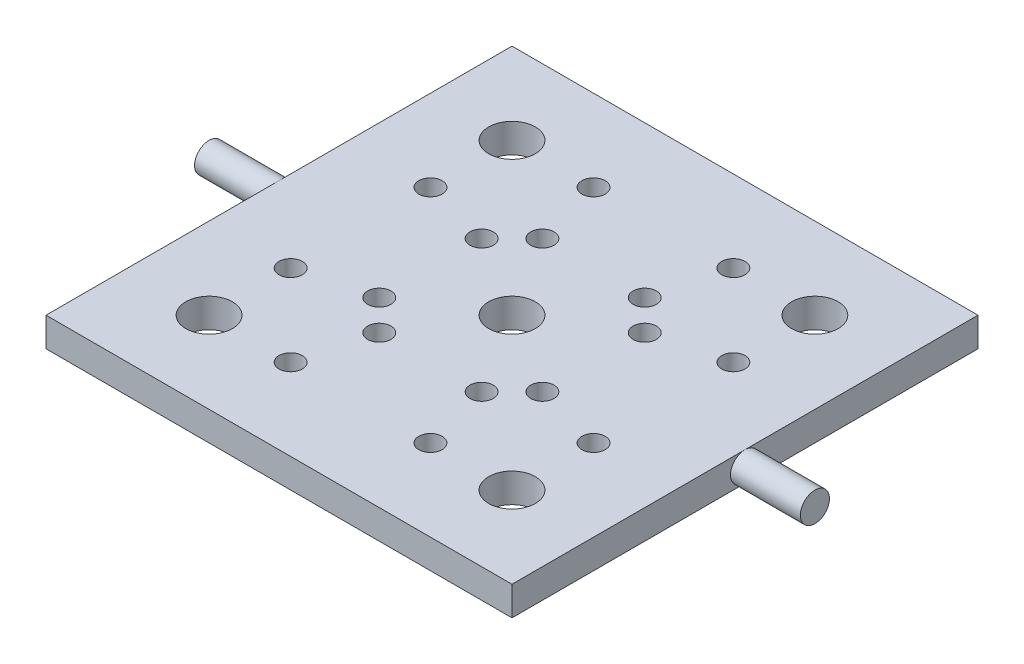
ISO-10303-21;
HEADER;
FILE_DESCRIPTION(('STEP AP214'),'2;1');
FILE_NAME('part.step','',(''),(''),'','','');
FILE_SCHEMA(('AUTOMOTIVE_DESIGN { 1 0 10303 214 1 1 1 1 }'));
ENDSEC;
DATA;
#1=APPLICATION_CONTEXT('core data for automotive mechanical design processes');
#2=APPLICATION_PROTOCOL_DEFINITION('international standard','automotive_design',2000,#1);
#3=PRODUCT_CONTEXT('',#1,'mechanical');
#4=PRODUCT('Part','Part','',(#3));
#5=PRODUCT_RELATED_PRODUCT_CATEGORY('part','',(#4));
#6=PRODUCT_DEFINITION_FORMATION('','',#4);
#7=PRODUCT_DEFINITION_CONTEXT('part definition',#1,'design');
#8=PRODUCT_DEFINITION('design','',#6,#7);
#9=PRODUCT_DEFINITION_SHAPE('','',#8);
#10=(LENGTH_UNIT() NAMED_UNIT(*) SI_UNIT(.MILLI.,.METRE.));
#11=(NAMED_UNIT(*) PLANE_ANGLE_UNIT() SI_UNIT($,.RADIAN.));
#12=(NAMED_UNIT(*) SI_UNIT($,.STERADIAN.) SOLID_ANGLE_UNIT());
#13=UNCERTAINTY_MEASURE_WITH_UNIT(LENGTH_MEASURE(1.E-05),#10,'distance_accuracy_value','');
#14=(GEOMETRIC_REPRESENTATION_CONTEXT(3) GLOBAL_UNCERTAINTY_ASSIGNED_CONTEXT((#13)) GLOBAL_UNIT_ASSIGNED_CONTEXT((#10,
#11,#12)) REPRESENTATION_CONTEXT('',''));
#15=CARTESIAN_POINT('',(0.,0.,0.));
#16=DIRECTION('',(0.,0.,1.));
#17=DIRECTION('',(1.,0.,0.));
#18=AXIS2_PLACEMENT_3D('',#15,#16,#17);
#19=CARTESIAN_POINT('',(-25.4,1.5875,25.4));
#20=DIRECTION('',(1.,0.,0.));
#21=DIRECTION('',(0.,0.,-1.));
#22=AXIS2_PLACEMENT_3D('',#19,#20,#21);
#23=PLANE('',#22);
#24=DIRECTION('',(0.,0.,1.));
#25=VECTOR('',#24,1.);
#26=CARTESIAN_POINT('',(-25.4,1.5875,25.4));
#27=LINE('',#26,#25);
#28=CARTESIAN_POINT('',(-25.4,1.5875,0.));
#29=VERTEX_POINT('',#28);
#30=CARTESIAN_POINT('',(-25.4,1.5875,25.4));
#31=VERTEX_POINT('',#30);
#32=EDGE_CURVE('E101',#29,#31,#27,.T.);
#33=ORIENTED_EDGE('',*,*,#32,.F.);
#34=CARTESIAN_POINT('',(-25.4,0.,0.));
#35=DIRECTION('',(1.,0.,0.));
#36=DIRECTION('',(0.,0.,-1.));
#37=AXIS2_PLACEMENT_3D('',#34,#35,#36);
#38=CIRCLE('',#37,1.5875);
#39=CARTESIAN_POINT('',(-25.4,-1.5875,0.));
#40=VERTEX_POINT('',#39);
#41=EDGE_CURVE('E51',#29,#40,#38,.T.);
#42=ORIENTED_EDGE('',*,*,#41,.T.);
#43=DIRECTION('',(0.,0.,1.));
#44=VECTOR('',#43,1.);
#45=CARTESIAN_POINT('',(-25.4,-1.5875,25.4));
#46=LINE('',#45,#44);
#47=CARTESIAN_POINT('',(-25.4,-1.5875,25.4));
#48=VERTEX_POINT('',#47);
#49=EDGE_CURVE('E99',#40,#48,#46,.T.);
#50=ORIENTED_EDGE('',*,*,#49,.T.);
#51=DIRECTION('',(0.,-1.,0.));
#52=VECTOR('',#51,1.);
#53=CARTESIAN_POINT('',(-25.4,1.5875,25.4));
#54=LINE('',#53,#52);
#55=EDGE_CURVE('E132',#31,#48,#54,.T.);
#56=ORIENTED_EDGE('',*,*,#55,.F.);
#57=EDGE_LOOP('',(#33,#42,#50,#56));
#58=FACE_BOUND('',#57,.T.);
#59=ADVANCED_FACE('F39',(#58),#23,.F.);
#60=CARTESIAN_POINT('',(25.4,1.5875,25.4));
#61=DIRECTION('',(-1.,0.,0.));
#62=DIRECTION('',(0.,0.,1.));
#63=AXIS2_PLACEMENT_3D('',#60,#61,#62);
#64=PLANE('',#63);
#65=CARTESIAN_POINT('',(25.4,0.,0.));
#66=DIRECTION('',(1.,0.,0.));
#67=DIRECTION('',(0.,0.,-1.));
#68=AXIS2_PLACEMENT_3D('',#65,#66,#67);
#69=CIRCLE('',#68,1.5875);
#70=CARTESIAN_POINT('',(25.4,1.5875,0.));
#71=VERTEX_POINT('',#70);
#72=CARTESIAN_POINT('',(25.4,-1.5875,0.));
#73=VERTEX_POINT('',#72);
#74=EDGE_CURVE('E143',#71,#73,#69,.T.);
#75=ORIENTED_EDGE('',*,*,#74,.F.);
#76=DIRECTION('',(0.,0.,-1.));
#77=VECTOR('',#76,1.);
#78=CARTESIAN_POINT('',(25.4,1.5875,25.4));
#79=LINE('',#78,#77);
#80=CARTESIAN_POINT('',(25.4,1.5875,25.4));
#81=VERTEX_POINT('',#80);
#82=EDGE_CURVE('E353',#81,#71,#79,.T.);
#83=ORIENTED_EDGE('',*,*,#82,.F.);
#84=DIRECTION('',(0.,-1.,0.));
#85=VECTOR('',#84,1.);
#86=CARTESIAN_POINT('',(25.4,1.5875,25.4));
#87=LINE('',#86,#85);
#88=CARTESIAN_POINT('',(25.4,-1.5875,25.4));
#89=VERTEX_POINT('',#88);
#90=EDGE_CURVE('E128',#81,#89,#87,.T.);
#91=ORIENTED_EDGE('',*,*,#90,.T.);
#92=DIRECTION('',(0.,0.,-1.));
#93=VECTOR('',#92,1.);
#94=CARTESIAN_POINT('',(25.4,-1.5875,25.4));
#95=LINE('',#94,#93);
#96=EDGE_CURVE('E362',#89,#73,#95,.T.);
#97=ORIENTED_EDGE('',*,*,#96,.T.);
#98=EDGE_LOOP('',(#75,#83,#91,#97));
#99=FACE_BOUND('',#98,.T.);
#100=ADVANCED_FACE('F361',(#99),#64,.F.);
#101=EDGE_CURVE('E49',#73,#71,#69,.T.);
#102=ORIENTED_EDGE('',*,*,#101,.F.);
#103=CARTESIAN_POINT('',(25.4,-1.5875,-25.4));
#104=VERTEX_POINT('',#103);
#105=EDGE_CURVE('E154',#73,#104,#95,.T.);
#106=ORIENTED_EDGE('',*,*,#105,.T.);
#107=DIRECTION('',(0.,-1.,0.));
#108=VECTOR('',#107,1.);
#109=CARTESIAN_POINT('',(25.4,1.5875,-25.4));
#110=LINE('',#109,#108);
#111=CARTESIAN_POINT('',(25.4,1.5875,-25.4));
#112=VERTEX_POINT('',#111);
#113=EDGE_CURVE('E43',#112,#104,#110,.T.);
#114=ORIENTED_EDGE('',*,*,#113,.F.);
#115=EDGE_CURVE('E123',#71,#112,#79,.T.);
#116=ORIENTED_EDGE('',*,*,#115,.F.);
#117=EDGE_LOOP('',(#102,#106,#114,#116));
#118=FACE_BOUND('',#117,.T.);
#119=ADVANCED_FACE('F41',(#118),#64,.F.);
#120=CARTESIAN_POINT('',(-25.4,1.5875,-25.4));
#121=DIRECTION('',(0.,0.,1.));
#122=DIRECTION('',(1.,0.,0.));
#123=AXIS2_PLACEMENT_3D('',#120,#121,#122);
#124=PLANE('',#123);
#125=DIRECTION('',(-1.,0.,0.));
#126=VECTOR('',#125,1.);
#127=CARTESIAN_POINT('',(-25.4,-1.5875,-25.4));
#128=LINE('',#127,#126);
#129=CARTESIAN_POINT('',(-25.4,-1.5875,-25.4));
#130=VERTEX_POINT('',#129);
#131=EDGE_CURVE('E115',#104,#130,#128,.T.);
#132=ORIENTED_EDGE('',*,*,#131,.T.);
#133=DIRECTION('',(0.,-1.,0.));
#134=VECTOR('',#133,1.);
#135=CARTESIAN_POINT('',(-25.4,1.5875,-25.4));
#136=LINE('',#135,#134);
#137=CARTESIAN_POINT('',(-25.4,1.5875,-25.4));
#138=VERTEX_POINT('',#137);
#139=EDGE_CURVE('E120',#138,#130,#136,.T.);
#140=ORIENTED_EDGE('',*,*,#139,.F.);
#141=DIRECTION('',(-1.,0.,0.));
#142=VECTOR('',#141,1.);
#143=CARTESIAN_POINT('',(-25.4,1.5875,-25.4));
#144=LINE('',#143,#142);
#145=EDGE_CURVE('E358',#112,#138,#144,.T.);
#146=ORIENTED_EDGE('',*,*,#145,.F.);
#147=ORIENTED_EDGE('',*,*,#113,.T.);
#148=EDGE_LOOP('',(#132,#140,#146,#147));
#149=FACE_BOUND('',#148,.T.);
#150=ADVANCED_FACE('F380',(#149),#124,.F.);
#151=EDGE_CURVE('E112',#130,#40,#46,.T.);
#152=ORIENTED_EDGE('',*,*,#151,.T.);
#153=EDGE_CURVE('E11',#40,#29,#38,.T.);
#154=ORIENTED_EDGE('',*,*,#153,.T.);
#155=EDGE_CURVE('E369',#138,#29,#27,.T.);
#156=ORIENTED_EDGE('',*,*,#155,.F.);
#157=ORIENTED_EDGE('',*,*,#139,.T.);
#158=EDGE_LOOP('',(#152,#154,#156,#157));
#159=FACE_BOUND('',#158,.T.);
#160=ADVANCED_FACE('F118',(#159),#23,.F.);
#161=CARTESIAN_POINT('',(-25.4,1.5875,25.4));
#162=DIRECTION('',(0.,0.,-1.));
#163=DIRECTION('',(-1.,0.,0.));
#164=AXIS2_PLACEMENT_3D('',#161,#162,#163);
#165=PLANE('',#164);
#166=DIRECTION('',(1.,0.,0.));
#167=VECTOR('',#166,1.);
#168=CARTESIAN_POINT('',(-25.4,-1.5875,25.4));
#169=LINE('',#168,#167);
#170=EDGE_CURVE('E113',#48,#89,#169,.T.);
#171=ORIENTED_EDGE('',*,*,#170,.T.);
#172=ORIENTED_EDGE('',*,*,#90,.F.);
#173=DIRECTION('',(1.,0.,0.));
#174=VECTOR('',#173,1.);
#175=CARTESIAN_POINT('',(-25.4,1.5875,25.4));
#176=LINE('',#175,#174);
#177=EDGE_CURVE('E133',#31,#81,#176,.T.);
#178=ORIENTED_EDGE('',*,*,#177,.F.);
#179=ORIENTED_EDGE('',*,*,#55,.T.);
#180=EDGE_LOOP('',(#171,#172,#178,#179));
#181=FACE_BOUND('',#180,.T.);
#182=ADVANCED_FACE('F341',(#181),#165,.F.);
#183=CARTESIAN_POINT('',(0.,1.5875,0.));
#184=DIRECTION('',(0.,-1.,0.));
#185=DIRECTION('',(0.,0.,-1.));
#186=AXIS2_PLACEMENT_3D('',#183,#184,#185);
#187=PLANE('',#186);
#188=CARTESIAN_POINT('',(-16.51,1.5875,7.62));
#189=DIRECTION('',(0.,1.,0.));
#190=DIRECTION('',(0.,0.,1.));
#191=AXIS2_PLACEMENT_3D('',#188,#189,#190);
#192=CIRCLE('',#191,1.27);
#193=CARTESIAN_POINT('',(-16.51,1.5875,8.89));
#194=VERTEX_POINT('',#193);
#195=EDGE_CURVE('E248',#194,#194,#192,.T.);
#196=ORIENTED_EDGE('',*,*,#195,.F.);
#197=EDGE_LOOP('',(#196));
#198=FACE_BOUND('',#197,.T.);
#199=CARTESIAN_POINT('',(16.51,1.5875,-7.62));
#200=DIRECTION('',(0.,1.,0.));
#201=DIRECTION('',(0.,0.,-1.));
#202=AXIS2_PLACEMENT_3D('',#199,#200,#201);
#203=CIRCLE('',#202,1.27);
#204=CARTESIAN_POINT('',(16.51,1.5875,-8.89));
#205=VERTEX_POINT('',#204);
#206=EDGE_CURVE('E257',#205,#205,#203,.T.);
#207=ORIENTED_EDGE('',*,*,#206,.F.);
#208=EDGE_LOOP('',(#207));
#209=FACE_BOUND('',#208,.T.);
#210=CARTESIAN_POINT('',(16.51,1.5875,7.62));
#211=DIRECTION('',(0.,1.,0.));
#212=DIRECTION('',(0.,0.,-1.));
#213=AXIS2_PLACEMENT_3D('',#210,#211,#212);
#214=CIRCLE('',#213,1.27);
#215=CARTESIAN_POINT('',(16.51,1.5875,6.35));
#216=VERTEX_POINT('',#215);
#217=EDGE_CURVE('E232',#216,#216,#214,.T.);
#218=ORIENTED_EDGE('',*,*,#217,.F.);
#219=EDGE_LOOP('',(#218));
#220=FACE_BOUND('',#219,.T.);
#221=CARTESIAN_POINT('',(-7.62000000000003,1.5875,16.51));
#222=DIRECTION('',(0.,1.,0.));
#223=DIRECTION('',(0.,0.,-1.));
#224=AXIS2_PLACEMENT_3D('',#221,#222,#223);
#225=CIRCLE('',#224,1.27);
#226=CARTESIAN_POINT('',(-7.62000000000003,1.5875,15.24));
#227=VERTEX_POINT('',#226);
#228=EDGE_CURVE('E241',#227,#227,#225,.T.);
#229=ORIENTED_EDGE('',*,*,#228,.F.);
#230=EDGE_LOOP('',(#229));
#231=FACE_BOUND('',#230,.T.);
#232=CARTESIAN_POINT('',(5.57822715367485,1.5875,-8.89000000000004));
#233=DIRECTION('',(0.,1.,0.));
#234=DIRECTION('',(0.,0.,1.));
#235=AXIS2_PLACEMENT_3D('',#232,#233,#234);
#236=CIRCLE('',#235,1.27000000000001);
#237=CARTESIAN_POINT('',(5.57822715367485,1.5875,-7.62000000000003));
#238=VERTEX_POINT('',#237);
#239=EDGE_CURVE('E289',#238,#238,#236,.T.);
#240=ORIENTED_EDGE('',*,*,#239,.F.);
#241=EDGE_LOOP('',(#240));
#242=FACE_BOUND('',#241,.T.);
#243=CARTESIAN_POINT('',(-5.57822715367482,1.5875,-8.88999999999993));
#244=DIRECTION('',(0.,1.,0.));
#245=DIRECTION('',(0.,0.,1.));
#246=AXIS2_PLACEMENT_3D('',#243,#244,#245);
#247=CIRCLE('',#246,1.27);
#248=CARTESIAN_POINT('',(-5.57822715367482,1.5875,-7.61999999999993));
#249=VERTEX_POINT('',#248);
#250=EDGE_CURVE('E281',#249,#249,#247,.T.);
#251=ORIENTED_EDGE('',*,*,#250,.F.);
#252=EDGE_LOOP('',(#251));
#253=FACE_BOUND('',#252,.T.);
#254=CARTESIAN_POINT('',(8.89000000000029,1.5875,5.57822715367478));
#255=DIRECTION('',(0.,1.,0.));
#256=DIRECTION('',(0.,0.,1.));
#257=AXIS2_PLACEMENT_3D('',#254,#255,#256);
#258=CIRCLE('',#257,1.27000000000001);
#259=CARTESIAN_POINT('',(8.89000000000029,1.5875,6.84822715367479));
#260=VERTEX_POINT('',#259);
#261=EDGE_CURVE('E273',#260,#260,#258,.T.);
#262=ORIENTED_EDGE('',*,*,#261,.F.);
#263=EDGE_LOOP('',(#262));
#264=FACE_BOUND('',#263,.T.);
#265=CARTESIAN_POINT('',(8.89000000000018,1.5875,-5.57822715367489));
#266=DIRECTION('',(0.,1.,0.));
#267=DIRECTION('',(0.,0.,1.));
#268=AXIS2_PLACEMENT_3D('',#265,#266,#267);
#269=CIRCLE('',#268,1.27);
#270=CARTESIAN_POINT('',(8.89000000000018,1.5875,-4.30822715367489));
#271=VERTEX_POINT('',#270);
#272=EDGE_CURVE('E264',#271,#271,#269,.T.);
#273=ORIENTED_EDGE('',*,*,#272,.F.);
#274=EDGE_LOOP('',(#273));
#275=FACE_BOUND('',#274,.T.);
#276=CARTESIAN_POINT('',(-16.51,1.5875,-16.51));
#277=DIRECTION('',(0.,1.,0.));
#278=DIRECTION('',(0.,0.,1.));
#279=AXIS2_PLACEMENT_3D('',#276,#277,#278);
#280=CIRCLE('',#279,2.54);
#281=CARTESIAN_POINT('',(-16.51,1.5875,-13.97));
#282=VERTEX_POINT('',#281);
#283=EDGE_CURVE('E193',#282,#282,#280,.T.);
#284=ORIENTED_EDGE('',*,*,#283,.F.);
#285=EDGE_LOOP('',(#284));
#286=FACE_BOUND('',#285,.T.);
#287=CARTESIAN_POINT('',(16.51,1.5875,-16.51));
#288=DIRECTION('',(0.,1.,0.));
#289=DIRECTION('',(0.,0.,1.));
#290=AXIS2_PLACEMENT_3D('',#287,#288,#289);
#291=CIRCLE('',#290,2.54);
#292=CARTESIAN_POINT('',(16.51,1.5875,-13.97));
#293=VERTEX_POINT('',#292);
#294=EDGE_CURVE('E185',#293,#293,#291,.T.);
#295=ORIENTED_EDGE('',*,*,#294,.F.);
#296=EDGE_LOOP('',(#295));
#297=FACE_BOUND('',#296,.T.);
#298=CARTESIAN_POINT('',(16.51,1.5875,16.51));
#299=DIRECTION('',(0.,1.,0.));
#300=DIRECTION('',(0.,0.,1.));
#301=AXIS2_PLACEMENT_3D('',#298,#299,#300);
#302=CIRCLE('',#301,2.54);
#303=CARTESIAN_POINT('',(16.51,1.5875,19.05));
#304=VERTEX_POINT('',#303);
#305=EDGE_CURVE('E177',#304,#304,#302,.T.);
#306=ORIENTED_EDGE('',*,*,#305,.F.);
#307=EDGE_LOOP('',(#306));
#308=FACE_BOUND('',#307,.T.);
#309=CARTESIAN_POINT('',(-16.51,1.5875,16.51));
#310=DIRECTION('',(0.,1.,0.));
#311=DIRECTION('',(0.,0.,1.));
#312=AXIS2_PLACEMENT_3D('',#309,#310,#311);
#313=CIRCLE('',#312,2.54);
#314=CARTESIAN_POINT('',(-16.51,1.5875,19.05));
#315=VERTEX_POINT('',#314);
#316=EDGE_CURVE('E168',#315,#315,#313,.T.);
#317=ORIENTED_EDGE('',*,*,#316,.F.);
#318=EDGE_LOOP('',(#317));
#319=FACE_BOUND('',#318,.T.);
#320=CARTESIAN_POINT('',(-16.51,1.5875,-7.62));
#321=DIRECTION('',(0.,1.,0.));
#322=DIRECTION('',(0.,0.,1.));
#323=AXIS2_PLACEMENT_3D('',#320,#321,#322);
#324=CIRCLE('',#323,1.27);
#325=CARTESIAN_POINT('',(-16.51,1.5875,-6.35));
#326=VERTEX_POINT('',#325);
#327=EDGE_CURVE('E225',#326,#326,#324,.T.);
#328=ORIENTED_EDGE('',*,*,#327,.F.);
#329=EDGE_LOOP('',(#328));
#330=FACE_BOUND('',#329,.T.);
#331=CARTESIAN_POINT('',(-7.62000000000001,1.5875,-16.51));
#332=DIRECTION('',(0.,1.,0.));
#333=DIRECTION('',(0.,0.,1.));
#334=AXIS2_PLACEMENT_3D('',#331,#332,#333);
#335=CIRCLE('',#334,1.27);
#336=CARTESIAN_POINT('',(-7.62000000000001,1.5875,-15.24));
#337=VERTEX_POINT('',#336);
#338=EDGE_CURVE('E217',#337,#337,#335,.T.);
#339=ORIENTED_EDGE('',*,*,#338,.F.);
#340=EDGE_LOOP('',(#339));
#341=FACE_BOUND('',#340,.T.);
#342=CARTESIAN_POINT('',(7.61999999999999,1.5875,-16.51));
#343=DIRECTION('',(0.,1.,0.));
#344=DIRECTION('',(0.,0.,1.));
#345=AXIS2_PLACEMENT_3D('',#342,#343,#344);
#346=CIRCLE('',#345,1.27);
#347=CARTESIAN_POINT('',(7.61999999999999,1.5875,-15.24));
#348=VERTEX_POINT('',#347);
#349=EDGE_CURVE('E209',#348,#348,#346,.T.);
#350=ORIENTED_EDGE('',*,*,#349,.F.);
#351=EDGE_LOOP('',(#350));
#352=FACE_BOUND('',#351,.T.);
#353=CARTESIAN_POINT('',(7.61999999999996,1.5875,16.51));
#354=DIRECTION('',(0.,1.,0.));
#355=DIRECTION('',(0.,0.,-1.));
#356=AXIS2_PLACEMENT_3D('',#353,#354,#355);
#357=CIRCLE('',#356,1.27);
#358=CARTESIAN_POINT('',(7.61999999999996,1.5875,15.24));
#359=VERTEX_POINT('',#358);
#360=EDGE_CURVE('E200',#359,#359,#357,.T.);
#361=ORIENTED_EDGE('',*,*,#360,.F.);
#362=EDGE_LOOP('',(#361));
#363=FACE_BOUND('',#362,.T.);
#364=CARTESIAN_POINT('',(-5.57822715367453,1.5875,8.89000000000022));
#365=DIRECTION('',(0.,1.,0.));
#366=DIRECTION('',(0.,0.,1.));
#367=AXIS2_PLACEMENT_3D('',#364,#365,#366);
#368=CIRCLE('',#367,1.27000000000001);
#369=CARTESIAN_POINT('',(-5.57822715367453,1.5875,10.1600000000002));
#370=VERTEX_POINT('',#369);
#371=EDGE_CURVE('E320',#370,#370,#368,.T.);
#372=ORIENTED_EDGE('',*,*,#371,.F.);
#373=EDGE_LOOP('',(#372));
#374=FACE_BOUND('',#373,.T.);
#375=CARTESIAN_POINT('',(5.57822715367514,1.5875,8.89000000000011));
#376=DIRECTION('',(0.,1.,0.));
#377=DIRECTION('',(0.,0.,1.));
#378=AXIS2_PLACEMENT_3D('',#375,#376,#377);
#379=CIRCLE('',#378,1.27);
#380=CARTESIAN_POINT('',(5.57822715367514,1.5875,10.1600000000001));
#381=VERTEX_POINT('',#380);
#382=EDGE_CURVE('E312',#381,#381,#379,.T.);
#383=ORIENTED_EDGE('',*,*,#382,.F.);
#384=EDGE_LOOP('',(#383));
#385=FACE_BOUND('',#384,.T.);
#386=CARTESIAN_POINT('',(-8.88999999999997,1.5875,-5.5782271536746));
#387=DIRECTION('',(0.,1.,0.));
#388=DIRECTION('',(0.,0.,1.));
#389=AXIS2_PLACEMENT_3D('',#386,#387,#388);
#390=CIRCLE('',#389,1.27000000000001);
#391=CARTESIAN_POINT('',(-8.88999999999997,1.5875,-4.30822715367459));
#392=VERTEX_POINT('',#391);
#393=EDGE_CURVE('E304',#392,#392,#390,.T.);
#394=ORIENTED_EDGE('',*,*,#393,.F.);
#395=EDGE_LOOP('',(#394));
#396=FACE_BOUND('',#395,.T.);
#397=CARTESIAN_POINT('',(-8.88999999999986,1.5875,5.57822715367507));
#398=DIRECTION('',(0.,1.,0.));
#399=DIRECTION('',(0.,0.,1.));
#400=AXIS2_PLACEMENT_3D('',#397,#398,#399);
#401=CIRCLE('',#400,1.27);
#402=CARTESIAN_POINT('',(-8.88999999999986,1.5875,6.84822715367507));
#403=VERTEX_POINT('',#402);
#404=EDGE_CURVE('E296',#403,#403,#401,.T.);
#405=ORIENTED_EDGE('',*,*,#404,.F.);
#406=EDGE_LOOP('',(#405));
#407=FACE_BOUND('',#406,.T.);
#408=CARTESIAN_POINT('',(0.,1.5875,0.));
#409=DIRECTION('',(0.,1.,0.));
#410=DIRECTION('',(0.,0.,1.));
#411=AXIS2_PLACEMENT_3D('',#408,#409,#410);
#412=CIRCLE('',#411,2.54);
#413=CARTESIAN_POINT('',(0.,1.5875,2.54));
#414=VERTEX_POINT('',#413);
#415=EDGE_CURVE('E160',#414,#414,#412,.T.);
#416=ORIENTED_EDGE('',*,*,#415,.F.);
#417=EDGE_LOOP('',(#416));
#418=FACE_BOUND('',#417,.T.);
#419=ORIENTED_EDGE('',*,*,#82,.T.);
#420=ORIENTED_EDGE('',*,*,#115,.T.);
#421=ORIENTED_EDGE('',*,*,#145,.T.);
#422=ORIENTED_EDGE('',*,*,#155,.T.);
#423=ORIENTED_EDGE('',*,*,#32,.T.);
#424=ORIENTED_EDGE('',*,*,#177,.T.);
#425=EDGE_LOOP('',(#419,#420,#421,#422,#423,#424));
#426=FACE_BOUND('',#425,.T.);
#427=ADVANCED_FACE('F338',(#198,#209,#220,#231,#242,#253,#264,#275,#286,#297,#308,#319,#330,
#341,#352,#363,#374,#385,#396,#407,#418,#426),#187,.F.);
#428=CARTESIAN_POINT('',(0.,-1.5875,0.));
#429=DIRECTION('',(0.,-1.,0.));
#430=DIRECTION('',(0.,0.,-1.));
#431=AXIS2_PLACEMENT_3D('',#428,#429,#430);
#432=PLANE('',#431);
#433=CARTESIAN_POINT('',(-16.51,-1.5875,7.62));
#434=DIRECTION('',(0.,1.,0.));
#435=DIRECTION('',(0.,0.,1.));
#436=AXIS2_PLACEMENT_3D('',#433,#434,#435);
#437=CIRCLE('',#436,1.27);
#438=CARTESIAN_POINT('',(-16.51,-1.5875,8.89));
#439=VERTEX_POINT('',#438);
#440=EDGE_CURVE('E252',#439,#439,#437,.T.);
#441=ORIENTED_EDGE('',*,*,#440,.T.);
#442=EDGE_LOOP('',(#441));
#443=FACE_BOUND('',#442,.T.);
#444=CARTESIAN_POINT('',(16.51,-1.5875,-7.62));
#445=DIRECTION('',(0.,1.,0.));
#446=DIRECTION('',(0.,0.,-1.));
#447=AXIS2_PLACEMENT_3D('',#444,#445,#446);
#448=CIRCLE('',#447,1.27);
#449=CARTESIAN_POINT('',(16.51,-1.5875,-8.89));
#450=VERTEX_POINT('',#449);
#451=EDGE_CURVE('E237',#450,#450,#448,.T.);
#452=ORIENTED_EDGE('',*,*,#451,.T.);
#453=EDGE_LOOP('',(#452));
#454=FACE_BOUND('',#453,.T.);
#455=CARTESIAN_POINT('',(16.51,-1.5875,7.62));
#456=DIRECTION('',(0.,1.,0.));
#457=DIRECTION('',(0.,0.,-1.));
#458=AXIS2_PLACEMENT_3D('',#455,#456,#457);
#459=CIRCLE('',#458,1.27);
#460=CARTESIAN_POINT('',(16.51,-1.5875,6.35));
#461=VERTEX_POINT('',#460);
#462=EDGE_CURVE('E236',#461,#461,#459,.T.);
#463=ORIENTED_EDGE('',*,*,#462,.T.);
#464=EDGE_LOOP('',(#463));
#465=FACE_BOUND('',#464,.T.);
#466=CARTESIAN_POINT('',(-7.62000000000003,-1.5875,16.51));
#467=DIRECTION('',(0.,1.,0.));
#468=DIRECTION('',(0.,0.,-1.));
#469=AXIS2_PLACEMENT_3D('',#466,#467,#468);
#470=CIRCLE('',#469,1.27);
#471=CARTESIAN_POINT('',(-7.62000000000003,-1.5875,15.24));
#472=VERTEX_POINT('',#471);
#473=EDGE_CURVE('E205',#472,#472,#470,.T.);
#474=ORIENTED_EDGE('',*,*,#473,.T.);
#475=EDGE_LOOP('',(#474));
#476=FACE_BOUND('',#475,.T.);
#477=CARTESIAN_POINT('',(5.57822715367485,-1.5875,-8.89000000000004));
#478=DIRECTION('',(0.,1.,0.));
#479=DIRECTION('',(0.,0.,1.));
#480=AXIS2_PLACEMENT_3D('',#477,#478,#479);
#481=CIRCLE('',#480,1.27000000000001);
#482=CARTESIAN_POINT('',(5.57822715367485,-1.5875,-7.62000000000003));
#483=VERTEX_POINT('',#482);
#484=EDGE_CURVE('E253',#483,#483,#481,.T.);
#485=ORIENTED_EDGE('',*,*,#484,.T.);
#486=EDGE_LOOP('',(#485));
#487=FACE_BOUND('',#486,.T.);
#488=CARTESIAN_POINT('',(-5.57822715367482,-1.5875,-8.88999999999993));
#489=DIRECTION('',(0.,1.,0.));
#490=DIRECTION('',(0.,0.,1.));
#491=AXIS2_PLACEMENT_3D('',#488,#489,#490);
#492=CIRCLE('',#491,1.27);
#493=CARTESIAN_POINT('',(-5.57822715367482,-1.5875,-7.61999999999993));
#494=VERTEX_POINT('',#493);
#495=EDGE_CURVE('E285',#494,#494,#492,.T.);
#496=ORIENTED_EDGE('',*,*,#495,.T.);
#497=EDGE_LOOP('',(#496));
#498=FACE_BOUND('',#497,.T.);
#499=CARTESIAN_POINT('',(8.89000000000029,-1.5875,5.57822715367478));
#500=DIRECTION('',(0.,1.,0.));
#501=DIRECTION('',(0.,0.,1.));
#502=AXIS2_PLACEMENT_3D('',#499,#500,#501);
#503=CIRCLE('',#502,1.27000000000001);
#504=CARTESIAN_POINT('',(8.89000000000029,-1.5875,6.84822715367479));
#505=VERTEX_POINT('',#504);
#506=EDGE_CURVE('E277',#505,#505,#503,.T.);
#507=ORIENTED_EDGE('',*,*,#506,.T.);
#508=EDGE_LOOP('',(#507));
#509=FACE_BOUND('',#508,.T.);
#510=CARTESIAN_POINT('',(8.89000000000018,-1.5875,-5.57822715367489));
#511=DIRECTION('',(0.,1.,0.));
#512=DIRECTION('',(0.,0.,1.));
#513=AXIS2_PLACEMENT_3D('',#510,#511,#512);
#514=CIRCLE('',#513,1.27);
#515=CARTESIAN_POINT('',(8.89000000000018,-1.5875,-4.30822715367489));
#516=VERTEX_POINT('',#515);
#517=EDGE_CURVE('E268',#516,#516,#514,.T.);
#518=ORIENTED_EDGE('',*,*,#517,.T.);
#519=EDGE_LOOP('',(#518));
#520=FACE_BOUND('',#519,.T.);
#521=CARTESIAN_POINT('',(-16.51,-1.5875,-16.51));
#522=DIRECTION('',(0.,1.,0.));
#523=DIRECTION('',(0.,0.,1.));
#524=AXIS2_PLACEMENT_3D('',#521,#522,#523);
#525=CIRCLE('',#524,2.54);
#526=CARTESIAN_POINT('',(-16.51,-1.5875,-13.97));
#527=VERTEX_POINT('',#526);
#528=EDGE_CURVE('E164',#527,#527,#525,.T.);
#529=ORIENTED_EDGE('',*,*,#528,.T.);
#530=EDGE_LOOP('',(#529));
#531=FACE_BOUND('',#530,.T.);
#532=CARTESIAN_POINT('',(16.51,-1.5875,-16.51));
#533=DIRECTION('',(0.,1.,0.));
#534=DIRECTION('',(0.,0.,1.));
#535=AXIS2_PLACEMENT_3D('',#532,#533,#534);
#536=CIRCLE('',#535,2.54);
#537=CARTESIAN_POINT('',(16.51,-1.5875,-13.97));
#538=VERTEX_POINT('',#537);
#539=EDGE_CURVE('E189',#538,#538,#536,.T.);
#540=ORIENTED_EDGE('',*,*,#539,.T.);
#541=EDGE_LOOP('',(#540));
#542=FACE_BOUND('',#541,.T.);
#543=CARTESIAN_POINT('',(16.51,-1.5875,16.51));
#544=DIRECTION('',(0.,1.,0.));
#545=DIRECTION('',(0.,0.,1.));
#546=AXIS2_PLACEMENT_3D('',#543,#544,#545);
#547=CIRCLE('',#546,2.54);
#548=CARTESIAN_POINT('',(16.51,-1.5875,19.05));
#549=VERTEX_POINT('',#548);
#550=EDGE_CURVE('E181',#549,#549,#547,.T.);
#551=ORIENTED_EDGE('',*,*,#550,.T.);
#552=EDGE_LOOP('',(#551));
#553=FACE_BOUND('',#552,.T.);
#554=CARTESIAN_POINT('',(-16.51,-1.5875,16.51));
#555=DIRECTION('',(0.,1.,0.));
#556=DIRECTION('',(0.,0.,1.));
#557=AXIS2_PLACEMENT_3D('',#554,#555,#556);
#558=CIRCLE('',#557,2.54);
#559=CARTESIAN_POINT('',(-16.51,-1.5875,19.05));
#560=VERTEX_POINT('',#559);
#561=EDGE_CURVE('E172',#560,#560,#558,.T.);
#562=ORIENTED_EDGE('',*,*,#561,.T.);
#563=EDGE_LOOP('',(#562));
#564=FACE_BOUND('',#563,.T.);
#565=CARTESIAN_POINT('',(-16.51,-1.5875,-7.62));
#566=DIRECTION('',(0.,1.,0.));
#567=DIRECTION('',(0.,0.,1.));
#568=AXIS2_PLACEMENT_3D('',#565,#566,#567);
#569=CIRCLE('',#568,1.27);
#570=CARTESIAN_POINT('',(-16.51,-1.5875,-6.35));
#571=VERTEX_POINT('',#570);
#572=EDGE_CURVE('E173',#571,#571,#569,.T.);
#573=ORIENTED_EDGE('',*,*,#572,.T.);
#574=EDGE_LOOP('',(#573));
#575=FACE_BOUND('',#574,.T.);
#576=CARTESIAN_POINT('',(-7.62000000000001,-1.5875,-16.51));
#577=DIRECTION('',(0.,1.,0.));
#578=DIRECTION('',(0.,0.,1.));
#579=AXIS2_PLACEMENT_3D('',#576,#577,#578);
#580=CIRCLE('',#579,1.27);
#581=CARTESIAN_POINT('',(-7.62000000000001,-1.5875,-15.24));
#582=VERTEX_POINT('',#581);
#583=EDGE_CURVE('E221',#582,#582,#580,.T.);
#584=ORIENTED_EDGE('',*,*,#583,.T.);
#585=EDGE_LOOP('',(#584));
#586=FACE_BOUND('',#585,.T.);
#587=CARTESIAN_POINT('',(7.61999999999999,-1.5875,-16.51));
#588=DIRECTION('',(0.,1.,0.));
#589=DIRECTION('',(0.,0.,1.));
#590=AXIS2_PLACEMENT_3D('',#587,#588,#589);
#591=CIRCLE('',#590,1.27);
#592=CARTESIAN_POINT('',(7.61999999999999,-1.5875,-15.24));
#593=VERTEX_POINT('',#592);
#594=EDGE_CURVE('E213',#593,#593,#591,.T.);
#595=ORIENTED_EDGE('',*,*,#594,.T.);
#596=EDGE_LOOP('',(#595));
#597=FACE_BOUND('',#596,.T.);
#598=CARTESIAN_POINT('',(7.61999999999996,-1.5875,16.51));
#599=DIRECTION('',(0.,1.,0.));
#600=DIRECTION('',(0.,0.,-1.));
#601=AXIS2_PLACEMENT_3D('',#598,#599,#600);
#602=CIRCLE('',#601,1.27);
#603=CARTESIAN_POINT('',(7.61999999999996,-1.5875,15.24));
#604=VERTEX_POINT('',#603);
#605=EDGE_CURVE('E204',#604,#604,#602,.T.);
#606=ORIENTED_EDGE('',*,*,#605,.T.);
#607=EDGE_LOOP('',(#606));
#608=FACE_BOUND('',#607,.T.);
#609=CARTESIAN_POINT('',(-5.57822715367453,-1.5875,8.89000000000022));
#610=DIRECTION('',(0.,1.,0.));
#611=DIRECTION('',(0.,0.,1.));
#612=AXIS2_PLACEMENT_3D('',#609,#610,#611);
#613=CIRCLE('',#612,1.27000000000001);
#614=CARTESIAN_POINT('',(-5.57822715367453,-1.5875,10.1600000000002));
#615=VERTEX_POINT('',#614);
#616=EDGE_CURVE('E269',#615,#615,#613,.T.);
#617=ORIENTED_EDGE('',*,*,#616,.T.);
#618=EDGE_LOOP('',(#617));
#619=FACE_BOUND('',#618,.T.);
#620=CARTESIAN_POINT('',(5.57822715367514,-1.5875,8.89000000000011));
#621=DIRECTION('',(0.,1.,0.));
#622=DIRECTION('',(0.,0.,1.));
#623=AXIS2_PLACEMENT_3D('',#620,#621,#622);
#624=CIRCLE('',#623,1.27);
#625=CARTESIAN_POINT('',(5.57822715367514,-1.5875,10.1600000000001));
#626=VERTEX_POINT('',#625);
#627=EDGE_CURVE('E316',#626,#626,#624,.T.);
#628=ORIENTED_EDGE('',*,*,#627,.T.);
#629=EDGE_LOOP('',(#628));
#630=FACE_BOUND('',#629,.T.);
#631=CARTESIAN_POINT('',(-8.88999999999997,-1.5875,-5.5782271536746));
#632=DIRECTION('',(0.,1.,0.));
#633=DIRECTION('',(0.,0.,1.));
#634=AXIS2_PLACEMENT_3D('',#631,#632,#633);
#635=CIRCLE('',#634,1.27000000000001);
#636=CARTESIAN_POINT('',(-8.88999999999997,-1.5875,-4.30822715367459));
#637=VERTEX_POINT('',#636);
#638=EDGE_CURVE('E308',#637,#637,#635,.T.);
#639=ORIENTED_EDGE('',*,*,#638,.T.);
#640=EDGE_LOOP('',(#639));
#641=FACE_BOUND('',#640,.T.);
#642=CARTESIAN_POINT('',(-8.88999999999986,-1.5875,5.57822715367507));
#643=DIRECTION('',(0.,1.,0.));
#644=DIRECTION('',(0.,0.,1.));
#645=AXIS2_PLACEMENT_3D('',#642,#643,#644);
#646=CIRCLE('',#645,1.27);
#647=CARTESIAN_POINT('',(-8.88999999999986,-1.5875,6.84822715367507));
#648=VERTEX_POINT('',#647);
#649=EDGE_CURVE('E300',#648,#648,#646,.T.);
#650=ORIENTED_EDGE('',*,*,#649,.T.);
#651=EDGE_LOOP('',(#650));
#652=FACE_BOUND('',#651,.T.);
#653=CARTESIAN_POINT('',(0.,-1.5875,0.));
#654=DIRECTION('',(0.,1.,0.));
#655=DIRECTION('',(0.,0.,1.));
#656=AXIS2_PLACEMENT_3D('',#653,#654,#655);
#657=CIRCLE('',#656,2.54);
#658=CARTESIAN_POINT('',(0.,-1.5875,2.54));
#659=VERTEX_POINT('',#658);
#660=EDGE_CURVE('E105',#659,#659,#657,.T.);
#661=ORIENTED_EDGE('',*,*,#660,.T.);
#662=EDGE_LOOP('',(#661));
#663=FACE_BOUND('',#662,.T.);
#664=ORIENTED_EDGE('',*,*,#96,.F.);
#665=ORIENTED_EDGE('',*,*,#170,.F.);
#666=ORIENTED_EDGE('',*,*,#49,.F.);
#667=ORIENTED_EDGE('',*,*,#151,.F.);
#668=ORIENTED_EDGE('',*,*,#131,.F.);
#669=ORIENTED_EDGE('',*,*,#105,.F.);
#670=EDGE_LOOP('',(#664,#665,#666,#667,#668,#669));
#671=FACE_BOUND('',#670,.T.);
#672=ADVANCED_FACE('F110',(#443,#454,#465,#476,#487,#498,#509,#520,#531,#542,#553,#564,#575,
#586,#597,#608,#619,#630,#641,#652,#663,#671),#432,.T.);
#673=CARTESIAN_POINT('',(33.02,0.,0.));
#674=DIRECTION('',(-1.,0.,0.));
#675=DIRECTION('',(0.,0.,1.));
#676=AXIS2_PLACEMENT_3D('',#673,#674,#675);
#677=CYLINDRICAL_SURFACE('',#676,1.5875);
#678=CARTESIAN_POINT('',(33.02,0.,0.));
#679=DIRECTION('',(1.,0.,0.));
#680=DIRECTION('',(0.,0.,-1.));
#681=AXIS2_PLACEMENT_3D('',#678,#679,#680);
#682=CIRCLE('',#681,1.5875);
#683=CARTESIAN_POINT('',(33.02,0.,-1.5875));
#684=VERTEX_POINT('',#683);
#685=EDGE_CURVE('E149',#684,#684,#682,.T.);
#686=ORIENTED_EDGE('',*,*,#685,.F.);
#687=EDGE_LOOP('',(#686));
#688=FACE_BOUND('',#687,.T.);
#689=ORIENTED_EDGE('',*,*,#74,.T.);
#690=ORIENTED_EDGE('',*,*,#101,.T.);
#691=EDGE_LOOP('',(#689,#690));
#692=FACE_BOUND('',#691,.T.);
#693=ADVANCED_FACE('F456',(#688,#692),#677,.T.);
#694=CARTESIAN_POINT('',(33.02,0.,0.));
#695=DIRECTION('',(1.,0.,0.));
#696=DIRECTION('',(0.,0.,-1.));
#697=AXIS2_PLACEMENT_3D('',#694,#695,#696);
#698=PLANE('',#697);
#699=ORIENTED_EDGE('',*,*,#685,.T.);
#700=EDGE_LOOP('',(#699));
#701=FACE_BOUND('',#700,.T.);
#702=ADVANCED_FACE('F430',(#701),#698,.T.);
#703=CARTESIAN_POINT('',(-33.02,0.,0.));
#704=DIRECTION('',(1.,0.,0.));
#705=DIRECTION('',(0.,0.,-1.));
#706=AXIS2_PLACEMENT_3D('',#703,#704,#705);
#707=CYLINDRICAL_SURFACE('',#706,1.5875);
#708=CARTESIAN_POINT('',(-33.02,0.,0.));
#709=DIRECTION('',(1.,0.,0.));
#710=DIRECTION('',(0.,0.,-1.));
#711=AXIS2_PLACEMENT_3D('',#708,#709,#710);
#712=CIRCLE('',#711,1.5875);
#713=CARTESIAN_POINT('',(-33.02,0.,-1.5875));
#714=VERTEX_POINT('',#713);
#715=EDGE_CURVE('E104',#714,#714,#712,.T.);
#716=ORIENTED_EDGE('',*,*,#715,.T.);
#717=EDGE_LOOP('',(#716));
#718=FACE_BOUND('',#717,.T.);
#719=ORIENTED_EDGE('',*,*,#41,.F.);
#720=ORIENTED_EDGE('',*,*,#153,.F.);
#721=EDGE_LOOP('',(#719,#720));
#722=FACE_BOUND('',#721,.T.);
#723=ADVANCED_FACE('F91',(#718,#722),#707,.T.);
#724=CARTESIAN_POINT('',(-33.02,0.,0.));
#725=DIRECTION('',(-1.,0.,0.));
#726=DIRECTION('',(0.,0.,-1.));
#727=AXIS2_PLACEMENT_3D('',#724,#725,#726);
#728=PLANE('',#727);
#729=ORIENTED_EDGE('',*,*,#715,.F.);
#730=EDGE_LOOP('',(#729));
#731=FACE_BOUND('',#730,.T.);
#732=ADVANCED_FACE('F429',(#731),#728,.T.);
#733=CARTESIAN_POINT('',(0.,-1.5875,0.));
#734=DIRECTION('',(0.,1.,0.));
#735=DIRECTION('',(0.,0.,1.));
#736=AXIS2_PLACEMENT_3D('',#733,#734,#735);
#737=CYLINDRICAL_SURFACE('',#736,2.54);
#738=ORIENTED_EDGE('',*,*,#660,.F.);
#739=EDGE_LOOP('',(#738));
#740=FACE_BOUND('',#739,.T.);
#741=ORIENTED_EDGE('',*,*,#415,.T.);
#742=EDGE_LOOP('',(#741));
#743=FACE_BOUND('',#742,.T.);
#744=ADVANCED_FACE('F440',(#740,#743),#737,.F.);
#745=CARTESIAN_POINT('',(-8.88999999999986,-1.5875,5.57822715367507));
#746=DIRECTION('',(0.,1.,0.));
#747=DIRECTION('',(0.,0.,1.));
#748=AXIS2_PLACEMENT_3D('',#745,#746,#747);
#749=CYLINDRICAL_SURFACE('',#748,1.27);
#750=ORIENTED_EDGE('',*,*,#649,.F.);
#751=EDGE_LOOP('',(#750));
#752=FACE_BOUND('',#751,.T.);
#753=ORIENTED_EDGE('',*,*,#404,.T.);
#754=EDGE_LOOP('',(#753));
#755=FACE_BOUND('',#754,.T.);
#756=ADVANCED_FACE('F464',(#752,#755),#749,.F.);
#757=CARTESIAN_POINT('',(-8.88999999999997,-1.5875,-5.5782271536746));
#758=DIRECTION('',(0.,1.,0.));
#759=DIRECTION('',(0.,0.,1.));
#760=AXIS2_PLACEMENT_3D('',#757,#758,#759);
#761=CYLINDRICAL_SURFACE('',#760,1.27000000000001);
#762=ORIENTED_EDGE('',*,*,#638,.F.);
#763=EDGE_LOOP('',(#762));
#764=FACE_BOUND('',#763,.T.);
#765=ORIENTED_EDGE('',*,*,#393,.T.);
#766=EDGE_LOOP('',(#765));
#767=FACE_BOUND('',#766,.T.);
#768=ADVANCED_FACE('F474',(#764,#767),#761,.F.);
#769=CARTESIAN_POINT('',(5.57822715367514,-1.5875,8.89000000000011));
#770=DIRECTION('',(0.,1.,0.));
#771=DIRECTION('',(0.,0.,1.));
#772=AXIS2_PLACEMENT_3D('',#769,#770,#771);
#773=CYLINDRICAL_SURFACE('',#772,1.27);
#774=ORIENTED_EDGE('',*,*,#627,.F.);
#775=EDGE_LOOP('',(#774));
#776=FACE_BOUND('',#775,.T.);
#777=ORIENTED_EDGE('',*,*,#382,.T.);
#778=EDGE_LOOP('',(#777));
#779=FACE_BOUND('',#778,.T.);
#780=ADVANCED_FACE('F334',(#776,#779),#773,.F.);
#781=CARTESIAN_POINT('',(-5.57822715367453,-1.5875,8.89000000000022));
#782=DIRECTION('',(0.,1.,0.));
#783=DIRECTION('',(0.,0.,1.));
#784=AXIS2_PLACEMENT_3D('',#781,#782,#783);
#785=CYLINDRICAL_SURFACE('',#784,1.27000000000001);
#786=ORIENTED_EDGE('',*,*,#616,.F.);
#787=EDGE_LOOP('',(#786));
#788=FACE_BOUND('',#787,.T.);
#789=ORIENTED_EDGE('',*,*,#371,.T.);
#790=EDGE_LOOP('',(#789));
#791=FACE_BOUND('',#790,.T.);
#792=ADVANCED_FACE('F330',(#788,#791),#785,.F.);
#793=CARTESIAN_POINT('',(7.61999999999996,-1.5875,16.51));
#794=DIRECTION('',(0.,1.,0.));
#795=DIRECTION('',(0.,0.,1.));
#796=AXIS2_PLACEMENT_3D('',#793,#794,#795);
#797=CYLINDRICAL_SURFACE('',#796,1.27);
#798=ORIENTED_EDGE('',*,*,#605,.F.);
#799=EDGE_LOOP('',(#798));
#800=FACE_BOUND('',#799,.T.);
#801=ORIENTED_EDGE('',*,*,#360,.T.);
#802=EDGE_LOOP('',(#801));
#803=FACE_BOUND('',#802,.T.);
#804=ADVANCED_FACE('F333',(#800,#803),#797,.F.);
#805=CARTESIAN_POINT('',(7.61999999999999,-1.5875,-16.51));
#806=DIRECTION('',(0.,1.,0.));
#807=DIRECTION('',(0.,0.,1.));
#808=AXIS2_PLACEMENT_3D('',#805,#806,#807);
#809=CYLINDRICAL_SURFACE('',#808,1.27);
#810=ORIENTED_EDGE('',*,*,#594,.F.);
#811=EDGE_LOOP('',(#810));
#812=FACE_BOUND('',#811,.T.);
#813=ORIENTED_EDGE('',*,*,#349,.T.);
#814=EDGE_LOOP('',(#813));
#815=FACE_BOUND('',#814,.T.);
#816=ADVANCED_FACE('F508',(#812,#815),#809,.F.);
#817=CARTESIAN_POINT('',(-7.62000000000001,-1.5875,-16.51));
#818=DIRECTION('',(0.,1.,0.));
#819=DIRECTION('',(0.,0.,1.));
#820=AXIS2_PLACEMENT_3D('',#817,#818,#819);
#821=CYLINDRICAL_SURFACE('',#820,1.27);
#822=ORIENTED_EDGE('',*,*,#583,.F.);
#823=EDGE_LOOP('',(#822));
#824=FACE_BOUND('',#823,.T.);
#825=ORIENTED_EDGE('',*,*,#338,.T.);
#826=EDGE_LOOP('',(#825));
#827=FACE_BOUND('',#826,.T.);
#828=ADVANCED_FACE('F518',(#824,#827),#821,.F.);
#829=CARTESIAN_POINT('',(-16.51,-1.5875,-7.62));
#830=DIRECTION('',(0.,1.,0.));
#831=DIRECTION('',(0.,0.,1.));
#832=AXIS2_PLACEMENT_3D('',#829,#830,#831);
#833=CYLINDRICAL_SURFACE('',#832,1.27);
#834=ORIENTED_EDGE('',*,*,#572,.F.);
#835=EDGE_LOOP('',(#834));
#836=FACE_BOUND('',#835,.T.);
#837=ORIENTED_EDGE('',*,*,#327,.T.);
#838=EDGE_LOOP('',(#837));
#839=FACE_BOUND('',#838,.T.);
#840=ADVANCED_FACE('F528',(#836,#839),#833,.F.);
#841=CARTESIAN_POINT('',(-16.51,-1.5875,16.51));
#842=DIRECTION('',(0.,1.,0.));
#843=DIRECTION('',(0.,0.,1.));
#844=AXIS2_PLACEMENT_3D('',#841,#842,#843);
#845=CYLINDRICAL_SURFACE('',#844,2.54);
#846=ORIENTED_EDGE('',*,*,#561,.F.);
#847=EDGE_LOOP('',(#846));
#848=FACE_BOUND('',#847,.T.);
#849=ORIENTED_EDGE('',*,*,#316,.T.);
#850=EDGE_LOOP('',(#849));
#851=FACE_BOUND('',#850,.T.);
#852=ADVANCED_FACE('F538',(#848,#851),#845,.F.);
#853=CARTESIAN_POINT('',(16.51,-1.5875,16.51));
#854=DIRECTION('',(0.,1.,0.));
#855=DIRECTION('',(0.,0.,1.));
#856=AXIS2_PLACEMENT_3D('',#853,#854,#855);
#857=CYLINDRICAL_SURFACE('',#856,2.54);
#858=ORIENTED_EDGE('',*,*,#550,.F.);
#859=EDGE_LOOP('',(#858));
#860=FACE_BOUND('',#859,.T.);
#861=ORIENTED_EDGE('',*,*,#305,.T.);
#862=EDGE_LOOP('',(#861));
#863=FACE_BOUND('',#862,.T.);
#864=ADVANCED_FACE('F548',(#860,#863),#857,.F.);
#865=CARTESIAN_POINT('',(16.51,-1.5875,-16.51));
#866=DIRECTION('',(0.,1.,0.));
#867=DIRECTION('',(0.,0.,1.));
#868=AXIS2_PLACEMENT_3D('',#865,#866,#867);
#869=CYLINDRICAL_SURFACE('',#868,2.54);
#870=ORIENTED_EDGE('',*,*,#539,.F.);
#871=EDGE_LOOP('',(#870));
#872=FACE_BOUND('',#871,.T.);
#873=ORIENTED_EDGE('',*,*,#294,.T.);
#874=EDGE_LOOP('',(#873));
#875=FACE_BOUND('',#874,.T.);
#876=ADVANCED_FACE('F558',(#872,#875),#869,.F.);
#877=CARTESIAN_POINT('',(-16.51,-1.5875,-16.51));
#878=DIRECTION('',(0.,1.,0.));
#879=DIRECTION('',(0.,0.,1.));
#880=AXIS2_PLACEMENT_3D('',#877,#878,#879);
#881=CYLINDRICAL_SURFACE('',#880,2.54);
#882=ORIENTED_EDGE('',*,*,#528,.F.);
#883=EDGE_LOOP('',(#882));
#884=FACE_BOUND('',#883,.T.);
#885=ORIENTED_EDGE('',*,*,#283,.T.);
#886=EDGE_LOOP('',(#885));
#887=FACE_BOUND('',#886,.T.);
#888=ADVANCED_FACE('F568',(#884,#887),#881,.F.);
#889=CARTESIAN_POINT('',(8.89000000000018,-1.5875,-5.57822715367489));
#890=DIRECTION('',(0.,1.,0.));
#891=DIRECTION('',(0.,0.,1.));
#892=AXIS2_PLACEMENT_3D('',#889,#890,#891);
#893=CYLINDRICAL_SURFACE('',#892,1.27);
#894=ORIENTED_EDGE('',*,*,#517,.F.);
#895=EDGE_LOOP('',(#894));
#896=FACE_BOUND('',#895,.T.);
#897=ORIENTED_EDGE('',*,*,#272,.T.);
#898=EDGE_LOOP('',(#897));
#899=FACE_BOUND('',#898,.T.);
#900=ADVANCED_FACE('F578',(#896,#899),#893,.F.);
#901=CARTESIAN_POINT('',(8.89000000000029,-1.5875,5.57822715367478));
#902=DIRECTION('',(0.,1.,0.));
#903=DIRECTION('',(0.,0.,1.));
#904=AXIS2_PLACEMENT_3D('',#901,#902,#903);
#905=CYLINDRICAL_SURFACE('',#904,1.27000000000001);
#906=ORIENTED_EDGE('',*,*,#506,.F.);
#907=EDGE_LOOP('',(#906));
#908=FACE_BOUND('',#907,.T.);
#909=ORIENTED_EDGE('',*,*,#261,.T.);
#910=EDGE_LOOP('',(#909));
#911=FACE_BOUND('',#910,.T.);
#912=ADVANCED_FACE('F588',(#908,#911),#905,.F.);
#913=CARTESIAN_POINT('',(-5.57822715367482,-1.5875,-8.88999999999993));
#914=DIRECTION('',(0.,1.,0.));
#915=DIRECTION('',(0.,0.,1.));
#916=AXIS2_PLACEMENT_3D('',#913,#914,#915);
#917=CYLINDRICAL_SURFACE('',#916,1.27);
#918=ORIENTED_EDGE('',*,*,#495,.F.);
#919=EDGE_LOOP('',(#918));
#920=FACE_BOUND('',#919,.T.);
#921=ORIENTED_EDGE('',*,*,#250,.T.);
#922=EDGE_LOOP('',(#921));
#923=FACE_BOUND('',#922,.T.);
#924=ADVANCED_FACE('F598',(#920,#923),#917,.F.);
#925=CARTESIAN_POINT('',(5.57822715367485,-1.5875,-8.89000000000004));
#926=DIRECTION('',(0.,1.,0.));
#927=DIRECTION('',(0.,0.,1.));
#928=AXIS2_PLACEMENT_3D('',#925,#926,#927);
#929=CYLINDRICAL_SURFACE('',#928,1.27000000000001);
#930=ORIENTED_EDGE('',*,*,#484,.F.);
#931=EDGE_LOOP('',(#930));
#932=FACE_BOUND('',#931,.T.);
#933=ORIENTED_EDGE('',*,*,#239,.T.);
#934=EDGE_LOOP('',(#933));
#935=FACE_BOUND('',#934,.T.);
#936=ADVANCED_FACE('F608',(#932,#935),#929,.F.);
#937=CARTESIAN_POINT('',(-7.62000000000003,-1.5875,16.51));
#938=DIRECTION('',(0.,1.,0.));
#939=DIRECTION('',(0.,0.,1.));
#940=AXIS2_PLACEMENT_3D('',#937,#938,#939);
#941=CYLINDRICAL_SURFACE('',#940,1.27);
#942=ORIENTED_EDGE('',*,*,#473,.F.);
#943=EDGE_LOOP('',(#942));
#944=FACE_BOUND('',#943,.T.);
#945=ORIENTED_EDGE('',*,*,#228,.T.);
#946=EDGE_LOOP('',(#945));
#947=FACE_BOUND('',#946,.T.);
#948=ADVANCED_FACE('F618',(#944,#947),#941,.F.);
#949=CARTESIAN_POINT('',(16.51,-1.5875,7.62));
#950=DIRECTION('',(0.,1.,0.));
#951=DIRECTION('',(0.,0.,1.));
#952=AXIS2_PLACEMENT_3D('',#949,#950,#951);
#953=CYLINDRICAL_SURFACE('',#952,1.27);
#954=ORIENTED_EDGE('',*,*,#462,.F.);
#955=EDGE_LOOP('',(#954));
#956=FACE_BOUND('',#955,.T.);
#957=ORIENTED_EDGE('',*,*,#217,.T.);
#958=EDGE_LOOP('',(#957));
#959=FACE_BOUND('',#958,.T.);
#960=ADVANCED_FACE('F628',(#956,#959),#953,.F.);
#961=CARTESIAN_POINT('',(16.51,-1.5875,-7.62));
#962=DIRECTION('',(0.,1.,0.));
#963=DIRECTION('',(0.,0.,1.));
#964=AXIS2_PLACEMENT_3D('',#961,#962,#963);
#965=CYLINDRICAL_SURFACE('',#964,1.27);
#966=ORIENTED_EDGE('',*,*,#451,.F.);
#967=EDGE_LOOP('',(#966));
#968=FACE_BOUND('',#967,.T.);
#969=ORIENTED_EDGE('',*,*,#206,.T.);
#970=EDGE_LOOP('',(#969));
#971=FACE_BOUND('',#970,.T.);
#972=ADVANCED_FACE('F638',(#968,#971),#965,.F.);
#973=CARTESIAN_POINT('',(-16.51,-1.5875,7.62));
#974=DIRECTION('',(0.,1.,0.));
#975=DIRECTION('',(0.,0.,1.));
#976=AXIS2_PLACEMENT_3D('',#973,#974,#975);
#977=CYLINDRICAL_SURFACE('',#976,1.27);
#978=ORIENTED_EDGE('',*,*,#440,.F.);
#979=EDGE_LOOP('',(#978));
#980=FACE_BOUND('',#979,.T.);
#981=ORIENTED_EDGE('',*,*,#195,.T.);
#982=EDGE_LOOP('',(#981));
#983=FACE_BOUND('',#982,.T.);
#984=ADVANCED_FACE('F648',(#980,#983),#977,.F.);
#985=CLOSED_SHELL('',(#59,#100,#119,#150,#160,#182,#427,#672,#693,#702,#723,#732,#744,#756,#768,
#780,#792,#804,#816,#828,#840,#852,#864,#876,#888,#900,#912,#924,#936,#948,#960,#972,#984));
#986=MANIFOLD_SOLID_BREP('B2',#985);
#987=ADVANCED_BREP_SHAPE_REPRESENTATION('',(#18,#986),#14);
#988=SHAPE_DEFINITION_REPRESENTATION(#9,#987);
ENDSEC;
END-ISO-10303-21;
